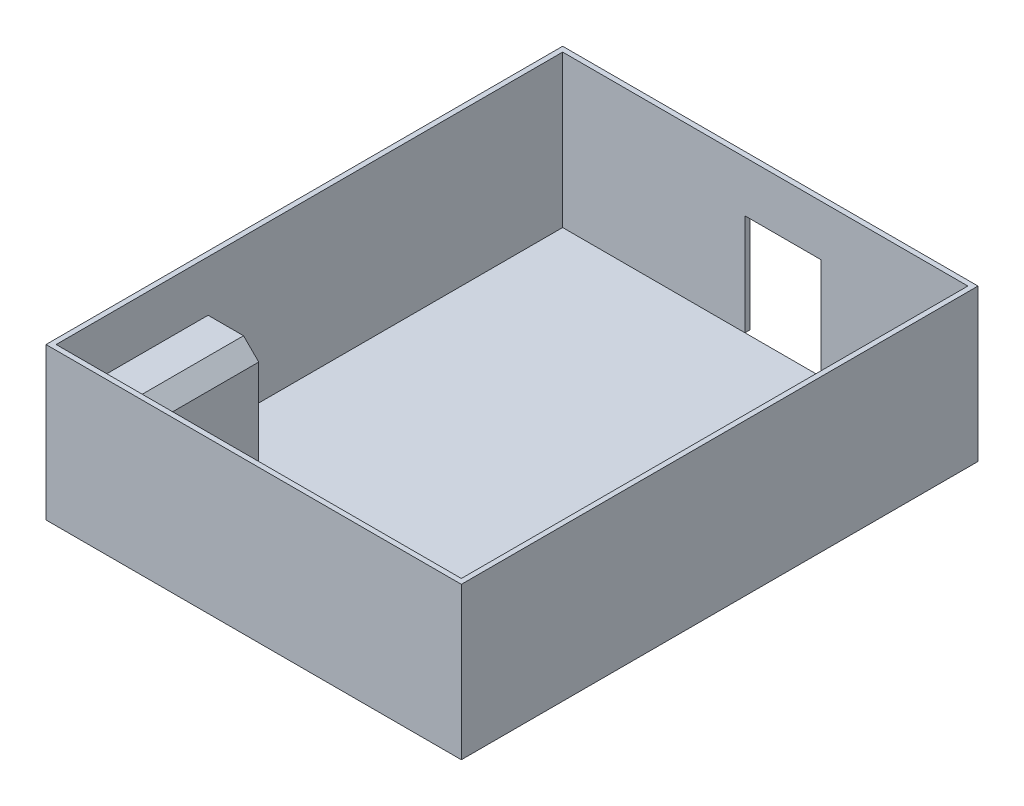
ISO-10303-21;
HEADER;
FILE_DESCRIPTION(('STEP AP214'),'2;1');
FILE_NAME('part.step','',(''),(''),'','','');
FILE_SCHEMA(('AUTOMOTIVE_DESIGN { 1 0 10303 214 1 1 1 1 }'));
ENDSEC;
DATA;
#1=APPLICATION_CONTEXT('core data for automotive mechanical design processes');
#2=APPLICATION_PROTOCOL_DEFINITION('international standard','automotive_design',2000,#1);
#3=PRODUCT_CONTEXT('',#1,'mechanical');
#4=PRODUCT('Part','Part','',(#3));
#5=PRODUCT_RELATED_PRODUCT_CATEGORY('part','',(#4));
#6=PRODUCT_DEFINITION_FORMATION('','',#4);
#7=PRODUCT_DEFINITION_CONTEXT('part definition',#1,'design');
#8=PRODUCT_DEFINITION('design','',#6,#7);
#9=PRODUCT_DEFINITION_SHAPE('','',#8);
#10=(LENGTH_UNIT() NAMED_UNIT(*) SI_UNIT(.MILLI.,.METRE.));
#11=(NAMED_UNIT(*) PLANE_ANGLE_UNIT() SI_UNIT($,.RADIAN.));
#12=(NAMED_UNIT(*) SI_UNIT($,.STERADIAN.) SOLID_ANGLE_UNIT());
#13=UNCERTAINTY_MEASURE_WITH_UNIT(LENGTH_MEASURE(1.E-05),#10,'distance_accuracy_value','');
#14=(GEOMETRIC_REPRESENTATION_CONTEXT(3) GLOBAL_UNCERTAINTY_ASSIGNED_CONTEXT((#13)) GLOBAL_UNIT_ASSIGNED_CONTEXT((#10,
#11,#12)) REPRESENTATION_CONTEXT('',''));
#15=CARTESIAN_POINT('',(0.,0.,0.));
#16=DIRECTION('',(0.,0.,1.));
#17=DIRECTION('',(1.,0.,0.));
#18=AXIS2_PLACEMENT_3D('',#15,#16,#17);
#19=CARTESIAN_POINT('',(-8000.,2010.,7.34788075816898E-13));
#20=DIRECTION('',(1.,0.,0.));
#21=DIRECTION('',(0.,0.,-1.));
#22=AXIS2_PLACEMENT_3D('',#19,#20,#21);
#23=PLANE('',#22);
#24=DIRECTION('',(0.,0.,1.));
#25=VECTOR('',#24,1.);
#26=CARTESIAN_POINT('',(-8000.,10.,7.34788075816898E-13));
#27=LINE('',#26,#25);
#28=CARTESIAN_POINT('',(-8000.,10.,-3000.));
#29=VERTEX_POINT('',#28);
#30=CARTESIAN_POINT('',(-8000.,10.,7.34788075816898E-13));
#31=VERTEX_POINT('',#30);
#32=EDGE_CURVE('E123',#29,#31,#27,.T.);
#33=ORIENTED_EDGE('',*,*,#32,.T.);
#34=DIRECTION('',(0.,-1.,0.));
#35=VECTOR('',#34,1.);
#36=CARTESIAN_POINT('',(-8000.,2010.,7.34788075816898E-13));
#37=LINE('',#36,#35);
#38=CARTESIAN_POINT('',(-8000.,2010.,7.34788075816898E-13));
#39=VERTEX_POINT('',#38);
#40=EDGE_CURVE('E106',#39,#31,#37,.T.);
#41=ORIENTED_EDGE('',*,*,#40,.F.);
#42=DIRECTION('',(0.,0.,1.));
#43=VECTOR('',#42,1.);
#44=CARTESIAN_POINT('',(-8000.,2010.,7.34788075816898E-13));
#45=LINE('',#44,#43);
#46=CARTESIAN_POINT('',(-8000.,2010.,-3000.));
#47=VERTEX_POINT('',#46);
#48=EDGE_CURVE('E113',#47,#39,#45,.T.);
#49=ORIENTED_EDGE('',*,*,#48,.F.);
#50=DIRECTION('',(0.,-1.,0.));
#51=VECTOR('',#50,1.);
#52=CARTESIAN_POINT('',(-8000.,2010.,-3000.));
#53=LINE('',#52,#51);
#54=EDGE_CURVE('E133',#47,#29,#53,.T.);
#55=ORIENTED_EDGE('',*,*,#54,.T.);
#56=EDGE_LOOP('',(#33,#41,#49,#55));
#57=FACE_BOUND('',#56,.T.);
#58=ADVANCED_FACE('F55',(#57),#23,.F.);
#59=CARTESIAN_POINT('',(-8000.,2010.,7.34788075816898E-13));
#60=DIRECTION('',(0.,0.,-1.));
#61=DIRECTION('',(-1.,0.,0.));
#62=AXIS2_PLACEMENT_3D('',#59,#60,#61);
#63=PLANE('',#62);
#64=DIRECTION('',(0.,-1.,0.));
#65=VECTOR('',#64,1.);
#66=CARTESIAN_POINT('',(-7000.,2010.,0.));
#67=LINE('',#66,#65);
#68=CARTESIAN_POINT('',(-7000.,1710.,0.));
#69=VERTEX_POINT('',#68);
#70=CARTESIAN_POINT('',(-7000.,10.,0.));
#71=VERTEX_POINT('',#70);
#72=EDGE_CURVE('E125',#69,#71,#67,.T.);
#73=ORIENTED_EDGE('',*,*,#72,.F.);
#74=DIRECTION('',(0.707106781186547,-0.707106781186548,0.));
#75=VECTOR('',#74,1.);
#76=CARTESIAN_POINT('',(-7300.,2010.,2.20436422745069E-13));
#77=LINE('',#76,#75);
#78=CARTESIAN_POINT('',(-7300.,2010.,2.20436422745069E-13));
#79=VERTEX_POINT('',#78);
#80=EDGE_CURVE('E12',#69,#79,#77,.F.);
#81=ORIENTED_EDGE('',*,*,#80,.T.);
#82=DIRECTION('',(1.,0.,0.));
#83=VECTOR('',#82,1.);
#84=CARTESIAN_POINT('',(-8000.,2010.,7.34788075816898E-13));
#85=LINE('',#84,#83);
#86=EDGE_CURVE('E101',#39,#79,#85,.T.);
#87=ORIENTED_EDGE('',*,*,#86,.F.);
#88=ORIENTED_EDGE('',*,*,#40,.T.);
#89=DIRECTION('',(1.,0.,0.));
#90=VECTOR('',#89,1.);
#91=CARTESIAN_POINT('',(-8000.,10.,7.34788075816898E-13));
#92=LINE('',#91,#90);
#93=EDGE_CURVE('E139',#31,#71,#92,.T.);
#94=ORIENTED_EDGE('',*,*,#93,.T.);
#95=EDGE_LOOP('',(#73,#81,#87,#88,#94));
#96=FACE_BOUND('',#95,.T.);
#97=ADVANCED_FACE('F103',(#96),#63,.F.);
#98=CARTESIAN_POINT('',(-7000.,2010.,0.));
#99=DIRECTION('',(-1.,0.,0.));
#100=DIRECTION('',(0.,0.,1.));
#101=AXIS2_PLACEMENT_3D('',#98,#99,#100);
#102=PLANE('',#101);
#103=DIRECTION('',(0.,-1.,0.));
#104=VECTOR('',#103,1.);
#105=CARTESIAN_POINT('',(-7000.,2010.,-3000.));
#106=LINE('',#105,#104);
#107=CARTESIAN_POINT('',(-7000.,1710.,-3000.));
#108=VERTEX_POINT('',#107);
#109=CARTESIAN_POINT('',(-7000.,10.,-3000.));
#110=VERTEX_POINT('',#109);
#111=EDGE_CURVE('E128',#108,#110,#106,.T.);
#112=ORIENTED_EDGE('',*,*,#111,.F.);
#113=DIRECTION('',(0.,0.,1.));
#114=VECTOR('',#113,1.);
#115=CARTESIAN_POINT('',(-7000.,1710.,0.));
#116=LINE('',#115,#114);
#117=EDGE_CURVE('E64',#108,#69,#116,.T.);
#118=ORIENTED_EDGE('',*,*,#117,.T.);
#119=ORIENTED_EDGE('',*,*,#72,.T.);
#120=DIRECTION('',(0.,0.,-1.));
#121=VECTOR('',#120,1.);
#122=CARTESIAN_POINT('',(-7000.,10.,0.));
#123=LINE('',#122,#121);
#124=EDGE_CURVE('E136',#71,#110,#123,.T.);
#125=ORIENTED_EDGE('',*,*,#124,.T.);
#126=EDGE_LOOP('',(#112,#118,#119,#125));
#127=FACE_BOUND('',#126,.T.);
#128=ADVANCED_FACE('F146',(#127),#102,.F.);
#129=CARTESIAN_POINT('',(-8000.,2010.,-3000.));
#130=DIRECTION('',(0.,0.,1.));
#131=DIRECTION('',(1.,0.,0.));
#132=AXIS2_PLACEMENT_3D('',#129,#130,#131);
#133=PLANE('',#132);
#134=DIRECTION('',(-1.,0.,0.));
#135=VECTOR('',#134,1.);
#136=CARTESIAN_POINT('',(-8000.,2010.,-3000.));
#137=LINE('',#136,#135);
#138=CARTESIAN_POINT('',(-7300.,2010.,-3000.));
#139=VERTEX_POINT('',#138);
#140=EDGE_CURVE('E112',#139,#47,#137,.T.);
#141=ORIENTED_EDGE('',*,*,#140,.F.);
#142=DIRECTION('',(-0.707106781186547,0.707106781186548,0.));
#143=VECTOR('',#142,1.);
#144=CARTESIAN_POINT('',(-7300.,2010.,-3000.));
#145=LINE('',#144,#143);
#146=EDGE_CURVE('E78',#139,#108,#145,.F.);
#147=ORIENTED_EDGE('',*,*,#146,.T.);
#148=ORIENTED_EDGE('',*,*,#111,.T.);
#149=DIRECTION('',(-1.,0.,0.));
#150=VECTOR('',#149,1.);
#151=CARTESIAN_POINT('',(-8000.,10.,-3000.));
#152=LINE('',#151,#150);
#153=EDGE_CURVE('E120',#110,#29,#152,.T.);
#154=ORIENTED_EDGE('',*,*,#153,.T.);
#155=ORIENTED_EDGE('',*,*,#54,.F.);
#156=EDGE_LOOP('',(#141,#147,#148,#154,#155));
#157=FACE_BOUND('',#156,.T.);
#158=ADVANCED_FACE('F148',(#157),#133,.F.);
#159=CARTESIAN_POINT('',(0.,2010.,0.));
#160=DIRECTION('',(0.,-1.,0.));
#161=DIRECTION('',(0.,0.,-1.));
#162=AXIS2_PLACEMENT_3D('',#159,#160,#161);
#163=PLANE('',#162);
#164=ORIENTED_EDGE('',*,*,#86,.T.);
#165=DIRECTION('',(0.,0.,-1.));
#166=VECTOR('',#165,1.);
#167=CARTESIAN_POINT('',(-7300.,2010.,0.));
#168=LINE('',#167,#166);
#169=EDGE_CURVE('E124',#79,#139,#168,.T.);
#170=ORIENTED_EDGE('',*,*,#169,.T.);
#171=ORIENTED_EDGE('',*,*,#140,.T.);
#172=ORIENTED_EDGE('',*,*,#48,.T.);
#173=EDGE_LOOP('',(#164,#170,#171,#172));
#174=FACE_BOUND('',#173,.T.);
#175=ADVANCED_FACE('F116',(#174),#163,.F.);
#176=CARTESIAN_POINT('',(0.,10.,0.));
#177=DIRECTION('',(0.,-1.,0.));
#178=DIRECTION('',(0.,0.,-1.));
#179=AXIS2_PLACEMENT_3D('',#176,#177,#178);
#180=PLANE('',#179);
#181=ORIENTED_EDGE('',*,*,#32,.F.);
#182=ORIENTED_EDGE('',*,*,#153,.F.);
#183=ORIENTED_EDGE('',*,*,#124,.F.);
#184=ORIENTED_EDGE('',*,*,#93,.F.);
#185=EDGE_LOOP('',(#181,#182,#183,#184));
#186=FACE_BOUND('',#185,.T.);
#187=ADVANCED_FACE('F145',(#186),#180,.T.);
#188=CARTESIAN_POINT('',(-7300.,2010.,0.));
#189=DIRECTION('',(-0.707106781186548,-0.707106781186547,0.));
#190=DIRECTION('',(0.,0.,-1.));
#191=AXIS2_PLACEMENT_3D('',#188,#189,#190);
#192=PLANE('',#191);
#193=ORIENTED_EDGE('',*,*,#80,.F.);
#194=ORIENTED_EDGE('',*,*,#117,.F.);
#195=ORIENTED_EDGE('',*,*,#146,.F.);
#196=ORIENTED_EDGE('',*,*,#169,.F.);
#197=EDGE_LOOP('',(#193,#194,#195,#196));
#198=FACE_BOUND('',#197,.T.);
#199=ADVANCED_FACE('F58',(#198),#192,.F.);
#200=CLOSED_SHELL('',(#58,#97,#128,#158,#175,#187,#199));
#201=MANIFOLD_SOLID_BREP('B2',#200);
#202=CARTESIAN_POINT('',(0.,3010.,0.));
#203=DIRECTION('',(0.,1.,0.));
#204=DIRECTION('',(0.,0.,1.));
#205=AXIS2_PLACEMENT_3D('',#202,#203,#204);
#206=PLANE('',#205);
#207=DIRECTION('',(1.,0.,0.));
#208=VECTOR('',#207,1.);
#209=CARTESIAN_POINT('',(-8100.,3010.,100.));
#210=LINE('',#209,#208);
#211=CARTESIAN_POINT('',(-8100.,3010.,100.));
#212=VERTEX_POINT('',#211);
#213=CARTESIAN_POINT('',(100.,3010.,100.));
#214=VERTEX_POINT('',#213);
#215=EDGE_CURVE('E384',#212,#214,#210,.T.);
#216=ORIENTED_EDGE('',*,*,#215,.T.);
#217=DIRECTION('',(0.,0.,-1.));
#218=VECTOR('',#217,1.);
#219=CARTESIAN_POINT('',(100.,3010.,100.));
#220=LINE('',#219,#218);
#221=CARTESIAN_POINT('',(100.,3010.,-10100.));
#222=VERTEX_POINT('',#221);
#223=EDGE_CURVE('E387',#214,#222,#220,.T.);
#224=ORIENTED_EDGE('',*,*,#223,.T.);
#225=DIRECTION('',(-1.,0.,0.));
#226=VECTOR('',#225,1.);
#227=CARTESIAN_POINT('',(100.,3010.,-10100.));
#228=LINE('',#227,#226);
#229=CARTESIAN_POINT('',(-8100.,3010.,-10100.));
#230=VERTEX_POINT('',#229);
#231=EDGE_CURVE('E390',#222,#230,#228,.T.);
#232=ORIENTED_EDGE('',*,*,#231,.T.);
#233=DIRECTION('',(0.,0.,1.));
#234=VECTOR('',#233,1.);
#235=CARTESIAN_POINT('',(-8100.,3010.,-10100.));
#236=LINE('',#235,#234);
#237=EDGE_CURVE('E392',#230,#212,#236,.T.);
#238=ORIENTED_EDGE('',*,*,#237,.T.);
#239=EDGE_LOOP('',(#216,#224,#232,#238));
#240=FACE_BOUND('',#239,.T.);
#241=DIRECTION('',(0.,0.,-1.));
#242=VECTOR('',#241,1.);
#243=CARTESIAN_POINT('',(0.,3010.,0.));
#244=LINE('',#243,#242);
#245=CARTESIAN_POINT('',(0.,3010.,0.));
#246=VERTEX_POINT('',#245);
#247=CARTESIAN_POINT('',(0.,3010.,-10000.));
#248=VERTEX_POINT('',#247);
#249=EDGE_CURVE('E357',#246,#248,#244,.T.);
#250=ORIENTED_EDGE('',*,*,#249,.F.);
#251=DIRECTION('',(1.,0.,0.));
#252=VECTOR('',#251,1.);
#253=CARTESIAN_POINT('',(-8000.,3010.,7.34788079488412E-13));
#254=LINE('',#253,#252);
#255=CARTESIAN_POINT('',(-8000.,3010.,7.34788079488412E-13));
#256=VERTEX_POINT('',#255);
#257=EDGE_CURVE('E355',#256,#246,#254,.T.);
#258=ORIENTED_EDGE('',*,*,#257,.F.);
#259=DIRECTION('',(0.,0.,1.));
#260=VECTOR('',#259,1.);
#261=CARTESIAN_POINT('',(-8000.,3010.,-10000.));
#262=LINE('',#261,#260);
#263=CARTESIAN_POINT('',(-8000.,3010.,-10000.));
#264=VERTEX_POINT('',#263);
#265=EDGE_CURVE('E362',#264,#256,#262,.T.);
#266=ORIENTED_EDGE('',*,*,#265,.F.);
#267=DIRECTION('',(-1.,0.,0.));
#268=VECTOR('',#267,1.);
#269=CARTESIAN_POINT('',(0.,3010.,-10000.));
#270=LINE('',#269,#268);
#271=EDGE_CURVE('E360',#248,#264,#270,.T.);
#272=ORIENTED_EDGE('',*,*,#271,.F.);
#273=EDGE_LOOP('',(#250,#258,#266,#272));
#274=FACE_BOUND('',#273,.T.);
#275=ADVANCED_FACE('F230',(#240,#274),#206,.T.);
#276=CARTESIAN_POINT('',(0.,10.,0.));
#277=DIRECTION('',(0.,1.,0.));
#278=DIRECTION('',(0.,0.,1.));
#279=AXIS2_PLACEMENT_3D('',#276,#277,#278);
#280=PLANE('',#279);
#281=DIRECTION('',(-1.,0.,0.));
#282=VECTOR('',#281,1.);
#283=CARTESIAN_POINT('',(100.,10.,-10100.));
#284=LINE('',#283,#282);
#285=CARTESIAN_POINT('',(-4400.,10.,-10100.));
#286=VERTEX_POINT('',#285);
#287=CARTESIAN_POINT('',(-8100.,10.,-10100.));
#288=VERTEX_POINT('',#287);
#289=EDGE_CURVE('E399',#286,#288,#284,.T.);
#290=ORIENTED_EDGE('',*,*,#289,.F.);
#291=DIRECTION('',(0.,0.,-1.));
#292=VECTOR('',#291,1.);
#293=CARTESIAN_POINT('',(-4400.,10.,-10000.));
#294=LINE('',#293,#292);
#295=CARTESIAN_POINT('',(-4400.,10.,-10000.));
#296=VERTEX_POINT('',#295);
#297=EDGE_CURVE('E348',#296,#286,#294,.T.);
#298=ORIENTED_EDGE('',*,*,#297,.F.);
#299=DIRECTION('',(-1.,0.,0.));
#300=VECTOR('',#299,1.);
#301=CARTESIAN_POINT('',(0.,10.,-10000.));
#302=LINE('',#301,#300);
#303=CARTESIAN_POINT('',(-8000.,10.,-10000.));
#304=VERTEX_POINT('',#303);
#305=EDGE_CURVE('E339',#296,#304,#302,.T.);
#306=ORIENTED_EDGE('',*,*,#305,.T.);
#307=DIRECTION('',(0.,0.,1.));
#308=VECTOR('',#307,1.);
#309=CARTESIAN_POINT('',(-8000.,10.,-10000.));
#310=LINE('',#309,#308);
#311=CARTESIAN_POINT('',(-8000.,10.,7.34788075816898E-13));
#312=VERTEX_POINT('',#311);
#313=EDGE_CURVE('E358',#304,#312,#310,.T.);
#314=ORIENTED_EDGE('',*,*,#313,.T.);
#315=DIRECTION('',(1.,0.,0.));
#316=VECTOR('',#315,1.);
#317=CARTESIAN_POINT('',(-8000.,10.,7.34788079488412E-13));
#318=LINE('',#317,#316);
#319=CARTESIAN_POINT('',(0.,10.,0.));
#320=VERTEX_POINT('',#319);
#321=EDGE_CURVE('E350',#312,#320,#318,.T.);
#322=ORIENTED_EDGE('',*,*,#321,.T.);
#323=DIRECTION('',(0.,0.,-1.));
#324=VECTOR('',#323,1.);
#325=CARTESIAN_POINT('',(0.,10.,0.));
#326=LINE('',#325,#324);
#327=CARTESIAN_POINT('',(0.,10.,-10000.));
#328=VERTEX_POINT('',#327);
#329=EDGE_CURVE('E367',#320,#328,#326,.T.);
#330=ORIENTED_EDGE('',*,*,#329,.T.);
#331=CARTESIAN_POINT('',(-2900.,10.0000000000001,-10000.));
#332=VERTEX_POINT('',#331);
#333=EDGE_CURVE('E370',#328,#332,#302,.T.);
#334=ORIENTED_EDGE('',*,*,#333,.T.);
#335=DIRECTION('',(0.,0.,-1.));
#336=VECTOR('',#335,1.);
#337=CARTESIAN_POINT('',(-2900.,10.0000000000001,-10000.));
#338=LINE('',#337,#336);
#339=CARTESIAN_POINT('',(-2900.,10.0000000000001,-10100.));
#340=VERTEX_POINT('',#339);
#341=EDGE_CURVE('E351',#332,#340,#338,.T.);
#342=ORIENTED_EDGE('',*,*,#341,.T.);
#343=CARTESIAN_POINT('',(100.,10.,-10100.));
#344=VERTEX_POINT('',#343);
#345=EDGE_CURVE('E400',#344,#340,#284,.T.);
#346=ORIENTED_EDGE('',*,*,#345,.F.);
#347=DIRECTION('',(0.,0.,-1.));
#348=VECTOR('',#347,1.);
#349=CARTESIAN_POINT('',(100.,10.,100.));
#350=LINE('',#349,#348);
#351=CARTESIAN_POINT('',(100.,10.,100.));
#352=VERTEX_POINT('',#351);
#353=EDGE_CURVE('E397',#352,#344,#350,.T.);
#354=ORIENTED_EDGE('',*,*,#353,.F.);
#355=DIRECTION('',(1.,0.,0.));
#356=VECTOR('',#355,1.);
#357=CARTESIAN_POINT('',(-8100.,10.,100.));
#358=LINE('',#357,#356);
#359=CARTESIAN_POINT('',(-8100.,10.,100.));
#360=VERTEX_POINT('',#359);
#361=EDGE_CURVE('E383',#360,#352,#358,.T.);
#362=ORIENTED_EDGE('',*,*,#361,.F.);
#363=DIRECTION('',(0.,0.,1.));
#364=VECTOR('',#363,1.);
#365=CARTESIAN_POINT('',(-8100.,10.,-10100.));
#366=LINE('',#365,#364);
#367=EDGE_CURVE('E388',#288,#360,#366,.T.);
#368=ORIENTED_EDGE('',*,*,#367,.F.);
#369=EDGE_LOOP('',(#290,#298,#306,#314,#322,#330,#334,#342,#346,#354,#362,#368));
#370=FACE_BOUND('',#369,.T.);
#371=ADVANCED_FACE('F419',(#370),#280,.F.);
#372=CARTESIAN_POINT('',(-8100.,3010.,100.));
#373=DIRECTION('',(0.,0.,-1.));
#374=DIRECTION('',(-1.,0.,0.));
#375=AXIS2_PLACEMENT_3D('',#372,#373,#374);
#376=PLANE('',#375);
#377=ORIENTED_EDGE('',*,*,#361,.T.);
#378=DIRECTION('',(0.,-1.,0.));
#379=VECTOR('',#378,1.);
#380=CARTESIAN_POINT('',(100.,3010.,100.));
#381=LINE('',#380,#379);
#382=EDGE_CURVE('E53',#214,#352,#381,.T.);
#383=ORIENTED_EDGE('',*,*,#382,.F.);
#384=ORIENTED_EDGE('',*,*,#215,.F.);
#385=DIRECTION('',(0.,-1.,0.));
#386=VECTOR('',#385,1.);
#387=CARTESIAN_POINT('',(-8100.,3010.,100.));
#388=LINE('',#387,#386);
#389=EDGE_CURVE('E394',#212,#360,#388,.T.);
#390=ORIENTED_EDGE('',*,*,#389,.T.);
#391=EDGE_LOOP('',(#377,#383,#384,#390));
#392=FACE_BOUND('',#391,.T.);
#393=ADVANCED_FACE('F232',(#392),#376,.F.);
#394=CARTESIAN_POINT('',(100.,3010.,100.));
#395=DIRECTION('',(-1.,0.,0.));
#396=DIRECTION('',(0.,0.,1.));
#397=AXIS2_PLACEMENT_3D('',#394,#395,#396);
#398=PLANE('',#397);
#399=ORIENTED_EDGE('',*,*,#353,.T.);
#400=DIRECTION('',(0.,-1.,0.));
#401=VECTOR('',#400,1.);
#402=CARTESIAN_POINT('',(100.,3010.,-10100.));
#403=LINE('',#402,#401);
#404=EDGE_CURVE('E238',#222,#344,#403,.T.);
#405=ORIENTED_EDGE('',*,*,#404,.F.);
#406=ORIENTED_EDGE('',*,*,#223,.F.);
#407=ORIENTED_EDGE('',*,*,#382,.T.);
#408=EDGE_LOOP('',(#399,#405,#406,#407));
#409=FACE_BOUND('',#408,.T.);
#410=ADVANCED_FACE('F445',(#409),#398,.F.);
#411=CARTESIAN_POINT('',(100.,3010.,-10100.));
#412=DIRECTION('',(0.,0.,1.));
#413=DIRECTION('',(1.,0.,0.));
#414=AXIS2_PLACEMENT_3D('',#411,#412,#413);
#415=PLANE('',#414);
#416=DIRECTION('',(1.,0.,0.));
#417=VECTOR('',#416,1.);
#418=CARTESIAN_POINT('',(-4400.,2010.,-10100.));
#419=LINE('',#418,#417);
#420=CARTESIAN_POINT('',(-4400.,2010.,-10100.));
#421=VERTEX_POINT('',#420);
#422=CARTESIAN_POINT('',(-2900.,2010.,-10100.));
#423=VERTEX_POINT('',#422);
#424=EDGE_CURVE('E342',#421,#423,#419,.T.);
#425=ORIENTED_EDGE('',*,*,#424,.F.);
#426=DIRECTION('',(0.,1.,0.));
#427=VECTOR('',#426,1.);
#428=CARTESIAN_POINT('',(-4400.,10.,-10100.));
#429=LINE('',#428,#427);
#430=EDGE_CURVE('E326',#286,#421,#429,.T.);
#431=ORIENTED_EDGE('',*,*,#430,.F.);
#432=ORIENTED_EDGE('',*,*,#289,.T.);
#433=DIRECTION('',(0.,-1.,0.));
#434=VECTOR('',#433,1.);
#435=CARTESIAN_POINT('',(-8100.,3010.,-10100.));
#436=LINE('',#435,#434);
#437=EDGE_CURVE('E406',#230,#288,#436,.T.);
#438=ORIENTED_EDGE('',*,*,#437,.F.);
#439=ORIENTED_EDGE('',*,*,#231,.F.);
#440=ORIENTED_EDGE('',*,*,#404,.T.);
#441=ORIENTED_EDGE('',*,*,#345,.T.);
#442=DIRECTION('',(0.,-1.,0.));
#443=VECTOR('',#442,1.);
#444=CARTESIAN_POINT('',(-2900.,10.0000000000001,-10100.));
#445=LINE('',#444,#443);
#446=EDGE_CURVE('E340',#423,#340,#445,.T.);
#447=ORIENTED_EDGE('',*,*,#446,.F.);
#448=EDGE_LOOP('',(#425,#431,#432,#438,#439,#440,#441,#447));
#449=FACE_BOUND('',#448,.T.);
#450=ADVANCED_FACE('F413',(#449),#415,.F.);
#451=CARTESIAN_POINT('',(-8100.,3010.,-10100.));
#452=DIRECTION('',(1.,0.,0.));
#453=DIRECTION('',(0.,0.,-1.));
#454=AXIS2_PLACEMENT_3D('',#451,#452,#453);
#455=PLANE('',#454);
#456=ORIENTED_EDGE('',*,*,#367,.T.);
#457=ORIENTED_EDGE('',*,*,#389,.F.);
#458=ORIENTED_EDGE('',*,*,#237,.F.);
#459=ORIENTED_EDGE('',*,*,#437,.T.);
#460=EDGE_LOOP('',(#456,#457,#458,#459));
#461=FACE_BOUND('',#460,.T.);
#462=ADVANCED_FACE('F439',(#461),#455,.F.);
#463=CARTESIAN_POINT('',(-8000.,3010.,7.34788079488412E-13));
#464=DIRECTION('',(0.,0.,-1.));
#465=DIRECTION('',(-1.,0.,0.));
#466=AXIS2_PLACEMENT_3D('',#463,#464,#465);
#467=PLANE('',#466);
#468=ORIENTED_EDGE('',*,*,#321,.F.);
#469=DIRECTION('',(0.,-1.,0.));
#470=VECTOR('',#469,1.);
#471=CARTESIAN_POINT('',(-8000.,3010.,7.34788079488412E-13));
#472=LINE('',#471,#470);
#473=EDGE_CURVE('E364',#256,#312,#472,.T.);
#474=ORIENTED_EDGE('',*,*,#473,.F.);
#475=ORIENTED_EDGE('',*,*,#257,.T.);
#476=DIRECTION('',(0.,-1.,0.));
#477=VECTOR('',#476,1.);
#478=CARTESIAN_POINT('',(0.,3010.,0.));
#479=LINE('',#478,#477);
#480=EDGE_CURVE('E380',#246,#320,#479,.T.);
#481=ORIENTED_EDGE('',*,*,#480,.T.);
#482=EDGE_LOOP('',(#468,#474,#475,#481));
#483=FACE_BOUND('',#482,.T.);
#484=ADVANCED_FACE('F430',(#483),#467,.T.);
#485=CARTESIAN_POINT('',(0.,3010.,0.));
#486=DIRECTION('',(-1.,0.,0.));
#487=DIRECTION('',(0.,0.,1.));
#488=AXIS2_PLACEMENT_3D('',#485,#486,#487);
#489=PLANE('',#488);
#490=ORIENTED_EDGE('',*,*,#329,.F.);
#491=ORIENTED_EDGE('',*,*,#480,.F.);
#492=ORIENTED_EDGE('',*,*,#249,.T.);
#493=DIRECTION('',(0.,-1.,0.));
#494=VECTOR('',#493,1.);
#495=CARTESIAN_POINT('',(0.,3010.,-10000.));
#496=LINE('',#495,#494);
#497=EDGE_CURVE('E378',#248,#328,#496,.T.);
#498=ORIENTED_EDGE('',*,*,#497,.T.);
#499=EDGE_LOOP('',(#490,#491,#492,#498));
#500=FACE_BOUND('',#499,.T.);
#501=ADVANCED_FACE('F427',(#500),#489,.T.);
#502=CARTESIAN_POINT('',(0.,3010.,-10000.));
#503=DIRECTION('',(0.,0.,1.));
#504=DIRECTION('',(1.,0.,0.));
#505=AXIS2_PLACEMENT_3D('',#502,#503,#504);
#506=PLANE('',#505);
#507=DIRECTION('',(0.,1.,0.));
#508=VECTOR('',#507,1.);
#509=CARTESIAN_POINT('',(-4400.,10.,-10000.));
#510=LINE('',#509,#508);
#511=CARTESIAN_POINT('',(-4400.,2010.,-10000.));
#512=VERTEX_POINT('',#511);
#513=EDGE_CURVE('E323',#296,#512,#510,.T.);
#514=ORIENTED_EDGE('',*,*,#513,.T.);
#515=DIRECTION('',(1.,0.,0.));
#516=VECTOR('',#515,1.);
#517=CARTESIAN_POINT('',(-4400.,2010.,-10000.));
#518=LINE('',#517,#516);
#519=CARTESIAN_POINT('',(-2900.,2010.,-10000.));
#520=VERTEX_POINT('',#519);
#521=EDGE_CURVE('E333',#512,#520,#518,.T.);
#522=ORIENTED_EDGE('',*,*,#521,.T.);
#523=DIRECTION('',(0.,-1.,0.));
#524=VECTOR('',#523,1.);
#525=CARTESIAN_POINT('',(-2900.,10.0000000000001,-10000.));
#526=LINE('',#525,#524);
#527=EDGE_CURVE('E245',#520,#332,#526,.T.);
#528=ORIENTED_EDGE('',*,*,#527,.T.);
#529=ORIENTED_EDGE('',*,*,#333,.F.);
#530=ORIENTED_EDGE('',*,*,#497,.F.);
#531=ORIENTED_EDGE('',*,*,#271,.T.);
#532=DIRECTION('',(0.,-1.,0.));
#533=VECTOR('',#532,1.);
#534=CARTESIAN_POINT('',(-8000.,3010.,-10000.));
#535=LINE('',#534,#533);
#536=EDGE_CURVE('E253',#264,#304,#535,.T.);
#537=ORIENTED_EDGE('',*,*,#536,.T.);
#538=ORIENTED_EDGE('',*,*,#305,.F.);
#539=EDGE_LOOP('',(#514,#522,#528,#529,#530,#531,#537,#538));
#540=FACE_BOUND('',#539,.T.);
#541=ADVANCED_FACE('F338',(#540),#506,.T.);
#542=CARTESIAN_POINT('',(-8000.,3010.,-10000.));
#543=DIRECTION('',(1.,0.,0.));
#544=DIRECTION('',(0.,0.,-1.));
#545=AXIS2_PLACEMENT_3D('',#542,#543,#544);
#546=PLANE('',#545);
#547=ORIENTED_EDGE('',*,*,#313,.F.);
#548=ORIENTED_EDGE('',*,*,#536,.F.);
#549=ORIENTED_EDGE('',*,*,#265,.T.);
#550=ORIENTED_EDGE('',*,*,#473,.T.);
#551=EDGE_LOOP('',(#547,#548,#549,#550));
#552=FACE_BOUND('',#551,.T.);
#553=ADVANCED_FACE('F435',(#552),#546,.T.);
#554=CARTESIAN_POINT('',(-4400.,10.,-10000.));
#555=DIRECTION('',(-1.,0.,0.));
#556=DIRECTION('',(0.,0.,1.));
#557=AXIS2_PLACEMENT_3D('',#554,#555,#556);
#558=PLANE('',#557);
#559=ORIENTED_EDGE('',*,*,#430,.T.);
#560=DIRECTION('',(0.,0.,-1.));
#561=VECTOR('',#560,1.);
#562=CARTESIAN_POINT('',(-4400.,2010.,-10000.));
#563=LINE('',#562,#561);
#564=EDGE_CURVE('E319',#512,#421,#563,.T.);
#565=ORIENTED_EDGE('',*,*,#564,.F.);
#566=ORIENTED_EDGE('',*,*,#513,.F.);
#567=ORIENTED_EDGE('',*,*,#297,.T.);
#568=EDGE_LOOP('',(#559,#565,#566,#567));
#569=FACE_BOUND('',#568,.T.);
#570=ADVANCED_FACE('F321',(#569),#558,.F.);
#571=CARTESIAN_POINT('',(-2900.,10.0000000000001,-10000.));
#572=DIRECTION('',(1.,0.,0.));
#573=DIRECTION('',(0.,0.,-1.));
#574=AXIS2_PLACEMENT_3D('',#571,#572,#573);
#575=PLANE('',#574);
#576=ORIENTED_EDGE('',*,*,#446,.T.);
#577=ORIENTED_EDGE('',*,*,#341,.F.);
#578=ORIENTED_EDGE('',*,*,#527,.F.);
#579=DIRECTION('',(0.,0.,-1.));
#580=VECTOR('',#579,1.);
#581=CARTESIAN_POINT('',(-2900.,2010.,-10000.));
#582=LINE('',#581,#580);
#583=EDGE_CURVE('E330',#520,#423,#582,.T.);
#584=ORIENTED_EDGE('',*,*,#583,.T.);
#585=EDGE_LOOP('',(#576,#577,#578,#584));
#586=FACE_BOUND('',#585,.T.);
#587=ADVANCED_FACE('F422',(#586),#575,.F.);
#588=CARTESIAN_POINT('',(-4400.,2010.,-10000.));
#589=DIRECTION('',(0.,1.,0.));
#590=DIRECTION('',(0.,0.,1.));
#591=AXIS2_PLACEMENT_3D('',#588,#589,#590);
#592=PLANE('',#591);
#593=ORIENTED_EDGE('',*,*,#424,.T.);
#594=ORIENTED_EDGE('',*,*,#583,.F.);
#595=ORIENTED_EDGE('',*,*,#521,.F.);
#596=ORIENTED_EDGE('',*,*,#564,.T.);
#597=EDGE_LOOP('',(#593,#594,#595,#596));
#598=FACE_BOUND('',#597,.T.);
#599=ADVANCED_FACE('F334',(#598),#592,.F.);
#600=CLOSED_SHELL('',(#275,#371,#393,#410,#450,#462,#484,#501,#541,#553,#570,#587,#599));
#601=MANIFOLD_SOLID_BREP('B6',#600);
#602=CARTESIAN_POINT('',(0.,10.,0.));
#603=DIRECTION('',(-1.,0.,0.));
#604=DIRECTION('',(0.,0.,1.));
#605=AXIS2_PLACEMENT_3D('',#602,#603,#604);
#606=PLANE('',#605);
#607=DIRECTION('',(0.,0.,-1.));
#608=VECTOR('',#607,1.);
#609=CARTESIAN_POINT('',(0.,0.,0.));
#610=LINE('',#609,#608);
#611=CARTESIAN_POINT('',(0.,0.,0.));
#612=VERTEX_POINT('',#611);
#613=CARTESIAN_POINT('',(0.,0.,-10000.));
#614=VERTEX_POINT('',#613);
#615=EDGE_CURVE('E639',#612,#614,#610,.T.);
#616=ORIENTED_EDGE('',*,*,#615,.T.);
#617=DIRECTION('',(0.,-1.,0.));
#618=VECTOR('',#617,1.);
#619=CARTESIAN_POINT('',(0.,10.,-10000.));
#620=LINE('',#619,#618);
#621=CARTESIAN_POINT('',(0.,10.,-10000.));
#622=VERTEX_POINT('',#621);
#623=EDGE_CURVE('E228',#622,#614,#620,.T.);
#624=ORIENTED_EDGE('',*,*,#623,.F.);
#625=DIRECTION('',(0.,0.,-1.));
#626=VECTOR('',#625,1.);
#627=CARTESIAN_POINT('',(0.,10.,0.));
#628=LINE('',#627,#626);
#629=CARTESIAN_POINT('',(0.,10.,0.));
#630=VERTEX_POINT('',#629);
#631=EDGE_CURVE('E627',#630,#622,#628,.T.);
#632=ORIENTED_EDGE('',*,*,#631,.F.);
#633=DIRECTION('',(0.,-1.,0.));
#634=VECTOR('',#633,1.);
#635=CARTESIAN_POINT('',(0.,10.,0.));
#636=LINE('',#635,#634);
#637=EDGE_CURVE('E635',#630,#612,#636,.T.);
#638=ORIENTED_EDGE('',*,*,#637,.T.);
#639=EDGE_LOOP('',(#616,#624,#632,#638));
#640=FACE_BOUND('',#639,.T.);
#641=ADVANCED_FACE('F576',(#640),#606,.F.);
#642=CARTESIAN_POINT('',(0.,10.,-10000.));
#643=DIRECTION('',(0.,0.,1.));
#644=DIRECTION('',(1.,0.,0.));
#645=AXIS2_PLACEMENT_3D('',#642,#643,#644);
#646=PLANE('',#645);
#647=DIRECTION('',(-1.,0.,0.));
#648=VECTOR('',#647,1.);
#649=CARTESIAN_POINT('',(0.,0.,-10000.));
#650=LINE('',#649,#648);
#651=CARTESIAN_POINT('',(-8000.,0.,-10000.));
#652=VERTEX_POINT('',#651);
#653=EDGE_CURVE('E631',#614,#652,#650,.T.);
#654=ORIENTED_EDGE('',*,*,#653,.T.);
#655=DIRECTION('',(0.,-1.,0.));
#656=VECTOR('',#655,1.);
#657=CARTESIAN_POINT('',(-8000.,10.,-10000.));
#658=LINE('',#657,#656);
#659=CARTESIAN_POINT('',(-8000.,10.,-10000.));
#660=VERTEX_POINT('',#659);
#661=EDGE_CURVE('E584',#660,#652,#658,.T.);
#662=ORIENTED_EDGE('',*,*,#661,.F.);
#663=DIRECTION('',(-1.,0.,0.));
#664=VECTOR('',#663,1.);
#665=CARTESIAN_POINT('',(0.,10.,-10000.));
#666=LINE('',#665,#664);
#667=EDGE_CURVE('E622',#622,#660,#666,.T.);
#668=ORIENTED_EDGE('',*,*,#667,.F.);
#669=ORIENTED_EDGE('',*,*,#623,.T.);
#670=EDGE_LOOP('',(#654,#662,#668,#669));
#671=FACE_BOUND('',#670,.T.);
#672=ADVANCED_FACE('F630',(#671),#646,.F.);
#673=CARTESIAN_POINT('',(-8000.,10.,7.34788079488412E-13));
#674=DIRECTION('',(1.,0.,0.));
#675=DIRECTION('',(0.,0.,-1.));
#676=AXIS2_PLACEMENT_3D('',#673,#674,#675);
#677=PLANE('',#676);
#678=DIRECTION('',(0.,0.,1.));
#679=VECTOR('',#678,1.);
#680=CARTESIAN_POINT('',(-8000.,0.,7.34788079488412E-13));
#681=LINE('',#680,#679);
#682=CARTESIAN_POINT('',(-8000.,0.,7.34788079488412E-13));
#683=VERTEX_POINT('',#682);
#684=EDGE_CURVE('E609',#652,#683,#681,.T.);
#685=ORIENTED_EDGE('',*,*,#684,.T.);
#686=DIRECTION('',(0.,-1.,0.));
#687=VECTOR('',#686,1.);
#688=CARTESIAN_POINT('',(-8000.,10.,7.34788079488412E-13));
#689=LINE('',#688,#687);
#690=CARTESIAN_POINT('',(-8000.,10.,7.34788079488412E-13));
#691=VERTEX_POINT('',#690);
#692=EDGE_CURVE('E632',#691,#683,#689,.T.);
#693=ORIENTED_EDGE('',*,*,#692,.F.);
#694=DIRECTION('',(0.,0.,1.));
#695=VECTOR('',#694,1.);
#696=CARTESIAN_POINT('',(-8000.,10.,7.34788079488412E-13));
#697=LINE('',#696,#695);
#698=EDGE_CURVE('E625',#660,#691,#697,.T.);
#699=ORIENTED_EDGE('',*,*,#698,.F.);
#700=ORIENTED_EDGE('',*,*,#661,.T.);
#701=EDGE_LOOP('',(#685,#693,#699,#700));
#702=FACE_BOUND('',#701,.T.);
#703=ADVANCED_FACE('F633',(#702),#677,.F.);
#704=CARTESIAN_POINT('',(0.,10.,0.));
#705=DIRECTION('',(0.,0.,-1.));
#706=DIRECTION('',(-1.,0.,0.));
#707=AXIS2_PLACEMENT_3D('',#704,#705,#706);
#708=PLANE('',#707);
#709=DIRECTION('',(1.,0.,0.));
#710=VECTOR('',#709,1.);
#711=CARTESIAN_POINT('',(0.,0.,0.));
#712=LINE('',#711,#710);
#713=EDGE_CURVE('E615',#683,#612,#712,.T.);
#714=ORIENTED_EDGE('',*,*,#713,.T.);
#715=ORIENTED_EDGE('',*,*,#637,.F.);
#716=DIRECTION('',(1.,0.,0.));
#717=VECTOR('',#716,1.);
#718=CARTESIAN_POINT('',(0.,10.,0.));
#719=LINE('',#718,#717);
#720=EDGE_CURVE('E592',#691,#630,#719,.T.);
#721=ORIENTED_EDGE('',*,*,#720,.F.);
#722=ORIENTED_EDGE('',*,*,#692,.T.);
#723=EDGE_LOOP('',(#714,#715,#721,#722));
#724=FACE_BOUND('',#723,.T.);
#725=ADVANCED_FACE('F646',(#724),#708,.F.);
#726=CARTESIAN_POINT('',(0.,10.,0.));
#727=DIRECTION('',(0.,1.,0.));
#728=DIRECTION('',(0.,0.,1.));
#729=AXIS2_PLACEMENT_3D('',#726,#727,#728);
#730=PLANE('',#729);
#731=ORIENTED_EDGE('',*,*,#631,.T.);
#732=ORIENTED_EDGE('',*,*,#667,.T.);
#733=ORIENTED_EDGE('',*,*,#698,.T.);
#734=ORIENTED_EDGE('',*,*,#720,.T.);
#735=EDGE_LOOP('',(#731,#732,#733,#734));
#736=FACE_BOUND('',#735,.T.);
#737=ADVANCED_FACE('F623',(#736),#730,.T.);
#738=CARTESIAN_POINT('',(0.,0.,0.));
#739=DIRECTION('',(0.,1.,0.));
#740=DIRECTION('',(0.,0.,1.));
#741=AXIS2_PLACEMENT_3D('',#738,#739,#740);
#742=PLANE('',#741);
#743=ORIENTED_EDGE('',*,*,#615,.F.);
#744=ORIENTED_EDGE('',*,*,#713,.F.);
#745=ORIENTED_EDGE('',*,*,#684,.F.);
#746=ORIENTED_EDGE('',*,*,#653,.F.);
#747=EDGE_LOOP('',(#743,#744,#745,#746));
#748=FACE_BOUND('',#747,.T.);
#749=ADVANCED_FACE('F649',(#748),#742,.F.);
#750=CLOSED_SHELL('',(#641,#672,#703,#725,#737,#749));
#751=MANIFOLD_SOLID_BREP('B47',#750);
#752=ADVANCED_BREP_SHAPE_REPRESENTATION('',(#18,#201,#601,#751),#14);
#753=SHAPE_DEFINITION_REPRESENTATION(#9,#752);
ENDSEC;
END-ISO-10303-21;
